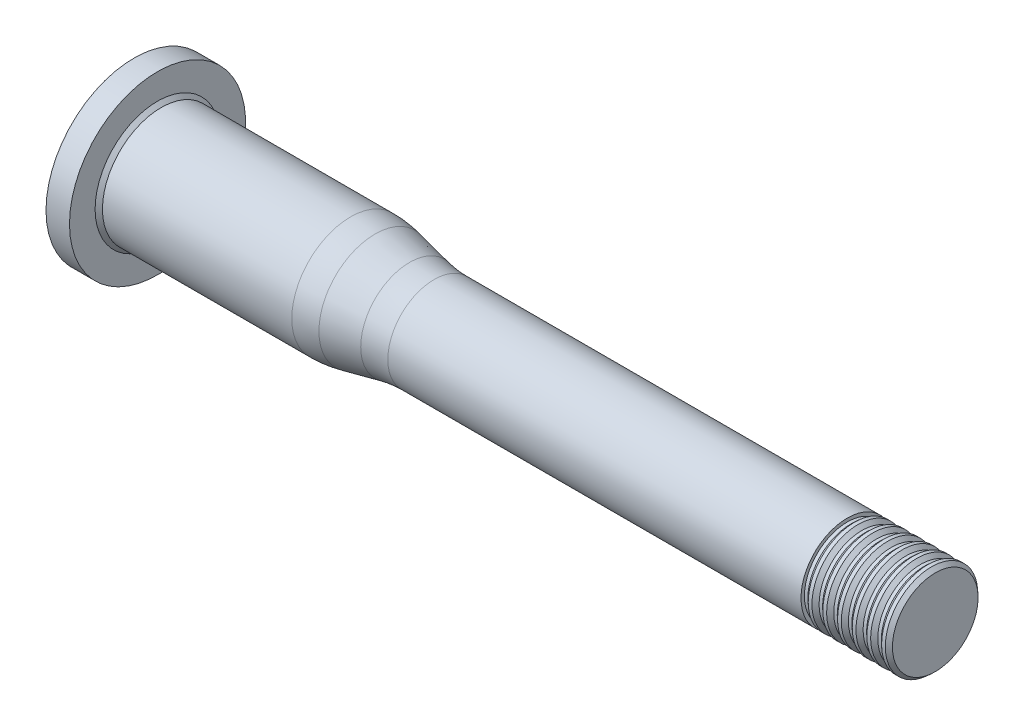
ISO-10303-21;
HEADER;
FILE_DESCRIPTION(('STEP AP214'),'2;1');
FILE_NAME('part.step','',(''),(''),'','','');
FILE_SCHEMA(('AUTOMOTIVE_DESIGN { 1 0 10303 214 1 1 1 1 }'));
ENDSEC;
DATA;
#1=APPLICATION_CONTEXT('core data for automotive mechanical design processes');
#2=APPLICATION_PROTOCOL_DEFINITION('international standard','automotive_design',2000,#1);
#3=PRODUCT_CONTEXT('',#1,'mechanical');
#4=PRODUCT('Part','Part','',(#3));
#5=PRODUCT_RELATED_PRODUCT_CATEGORY('part','',(#4));
#6=PRODUCT_DEFINITION_FORMATION('','',#4);
#7=PRODUCT_DEFINITION_CONTEXT('part definition',#1,'design');
#8=PRODUCT_DEFINITION('design','',#6,#7);
#9=PRODUCT_DEFINITION_SHAPE('','',#8);
#10=(LENGTH_UNIT() NAMED_UNIT(*) SI_UNIT(.MILLI.,.METRE.));
#11=(NAMED_UNIT(*) PLANE_ANGLE_UNIT() SI_UNIT($,.RADIAN.));
#12=(NAMED_UNIT(*) SI_UNIT($,.STERADIAN.) SOLID_ANGLE_UNIT());
#13=UNCERTAINTY_MEASURE_WITH_UNIT(LENGTH_MEASURE(1.E-05),#10,'distance_accuracy_value','');
#14=(GEOMETRIC_REPRESENTATION_CONTEXT(3) GLOBAL_UNCERTAINTY_ASSIGNED_CONTEXT((#13)) GLOBAL_UNIT_ASSIGNED_CONTEXT((#10,
#11,#12)) REPRESENTATION_CONTEXT('',''));
#15=CARTESIAN_POINT('',(0.,0.,0.));
#16=DIRECTION('',(0.,0.,1.));
#17=DIRECTION('',(1.,0.,0.));
#18=AXIS2_PLACEMENT_3D('',#15,#16,#17);
#19=CARTESIAN_POINT('',(162.676397848872,0.,0.));
#20=DIRECTION('',(1.,0.,0.));
#21=DIRECTION('',(0.,0.,-1.));
#22=AXIS2_PLACEMENT_3D('',#19,#20,#21);
#23=CONICAL_SURFACE('',#22,9.2634,0.739062507559056);
#24=CARTESIAN_POINT('',(162.676397848872,0.,0.));
#25=DIRECTION('',(-1.,0.,0.));
#26=DIRECTION('',(0.,0.,1.));
#27=AXIS2_PLACEMENT_3D('',#24,#25,#26);
#28=CIRCLE('',#27,9.2634);
#29=CARTESIAN_POINT('',(162.676397848872,0.,9.2634));
#30=VERTEX_POINT('',#29);
#31=EDGE_CURVE('E177',#30,#30,#28,.T.);
#32=ORIENTED_EDGE('',*,*,#31,.F.);
#33=EDGE_LOOP('',(#32));
#34=FACE_BOUND('',#33,.T.);
#35=CARTESIAN_POINT('',(163.484629928296,0.,0.));
#36=DIRECTION('',(1.,0.,0.));
#37=DIRECTION('',(0.,0.,-1.));
#38=AXIS2_PLACEMENT_3D('',#35,#36,#37);
#39=CIRCLE('',#38,10.);
#40=CARTESIAN_POINT('',(163.484629928296,0.,-10.));
#41=VERTEX_POINT('',#40);
#42=EDGE_CURVE('E186',#41,#41,#39,.F.);
#43=ORIENTED_EDGE('',*,*,#42,.T.);
#44=EDGE_LOOP('',(#43));
#45=FACE_BOUND('',#44,.T.);
#46=ADVANCED_FACE('F33',(#34,#45),#23,.T.);
#47=CARTESIAN_POINT('',(-11.7608101461,0.,0.));
#48=DIRECTION('',(-1.,0.,0.));
#49=DIRECTION('',(0.,0.,1.));
#50=AXIS2_PLACEMENT_3D('',#47,#48,#49);
#51=CYLINDRICAL_SURFACE('',#50,9.2634);
#52=ORIENTED_EDGE('',*,*,#31,.T.);
#53=EDGE_LOOP('',(#52));
#54=FACE_BOUND('',#53,.T.);
#55=CARTESIAN_POINT('',(161.925,0.,0.));
#56=DIRECTION('',(-1.,0.,0.));
#57=DIRECTION('',(0.,0.,1.));
#58=AXIS2_PLACEMENT_3D('',#55,#56,#57);
#59=CIRCLE('',#58,9.2634);
#60=CARTESIAN_POINT('',(161.925,0.,9.2634));
#61=VERTEX_POINT('',#60);
#62=EDGE_CURVE('E169',#61,#61,#59,.T.);
#63=ORIENTED_EDGE('',*,*,#62,.F.);
#64=EDGE_LOOP('',(#63));
#65=FACE_BOUND('',#64,.T.);
#66=ADVANCED_FACE('F251',(#54,#65),#51,.T.);
#67=CARTESIAN_POINT('',(-8.58581014610001,0.,0.));
#68=DIRECTION('',(-1.,0.,0.));
#69=DIRECTION('',(0.,0.,1.));
#70=AXIS2_PLACEMENT_3D('',#67,#68,#69);
#71=CYLINDRICAL_SURFACE('',#70,10.);
#72=ORIENTED_EDGE('',*,*,#42,.F.);
#73=EDGE_LOOP('',(#72));
#74=FACE_BOUND('',#73,.T.);
#75=CARTESIAN_POINT('',(164.291767920576,0.,0.));
#76=DIRECTION('',(-1.,0.,0.));
#77=DIRECTION('',(0.,0.,1.));
#78=AXIS2_PLACEMENT_3D('',#75,#76,#77);
#79=CIRCLE('',#78,10.);
#80=CARTESIAN_POINT('',(164.291767920576,0.,10.));
#81=VERTEX_POINT('',#80);
#82=EDGE_CURVE('E183',#81,#81,#79,.F.);
#83=ORIENTED_EDGE('',*,*,#82,.F.);
#84=EDGE_LOOP('',(#83));
#85=FACE_BOUND('',#84,.T.);
#86=ADVANCED_FACE('F257',(#74,#85),#71,.T.);
#87=CARTESIAN_POINT('',(164.263897848872,0.,0.));
#88=DIRECTION('',(-1.,0.,0.));
#89=DIRECTION('',(0.,0.,1.));
#90=AXIS2_PLACEMENT_3D('',#87,#88,#89);
#91=CONICAL_SURFACE('',#90,10.0254,0.739062507559089);
#92=CARTESIAN_POINT('',(165.1,0.,0.));
#93=DIRECTION('',(-1.,0.,0.));
#94=DIRECTION('',(0.,0.,1.));
#95=AXIS2_PLACEMENT_3D('',#92,#93,#94);
#96=CIRCLE('',#95,9.2634);
#97=CARTESIAN_POINT('',(165.1,0.,9.2634));
#98=VERTEX_POINT('',#97);
#99=EDGE_CURVE('E180',#98,#98,#96,.T.);
#100=ORIENTED_EDGE('',*,*,#99,.T.);
#101=EDGE_LOOP('',(#100));
#102=FACE_BOUND('',#101,.T.);
#103=ORIENTED_EDGE('',*,*,#82,.T.);
#104=EDGE_LOOP('',(#103));
#105=FACE_BOUND('',#104,.T.);
#106=ADVANCED_FACE('F264',(#102,#105),#91,.T.);
#107=CARTESIAN_POINT('',(168.275,0.,0.));
#108=DIRECTION('',(-1.,0.,0.));
#109=DIRECTION('',(0.,0.,1.));
#110=AXIS2_PLACEMENT_3D('',#107,#108,#109);
#111=PLANE('',#110);
#112=CARTESIAN_POINT('',(168.275,0.,0.));
#113=DIRECTION('',(-1.,0.,0.));
#114=DIRECTION('',(0.,0.,1.));
#115=AXIS2_PLACEMENT_3D('',#112,#113,#114);
#116=CIRCLE('',#115,9.2634);
#117=CARTESIAN_POINT('',(168.275,0.,9.2634));
#118=VERTEX_POINT('',#117);
#119=EDGE_CURVE('E190',#118,#118,#116,.T.);
#120=ORIENTED_EDGE('',*,*,#119,.F.);
#121=EDGE_LOOP('',(#120));
#122=FACE_BOUND('',#121,.T.);
#123=ADVANCED_FACE('F267',(#122),#111,.F.);
#124=CARTESIAN_POINT('',(167.438897848872,0.,0.));
#125=DIRECTION('',(-1.,0.,0.));
#126=DIRECTION('',(0.,0.,1.));
#127=AXIS2_PLACEMENT_3D('',#124,#125,#126);
#128=CONICAL_SURFACE('',#127,10.0254,0.739062507559089);
#129=ORIENTED_EDGE('',*,*,#119,.T.);
#130=EDGE_LOOP('',(#129));
#131=FACE_BOUND('',#130,.T.);
#132=CARTESIAN_POINT('',(167.466767920576,0.,0.));
#133=DIRECTION('',(-1.,0.,0.));
#134=DIRECTION('',(0.,0.,1.));
#135=AXIS2_PLACEMENT_3D('',#132,#133,#134);
#136=CIRCLE('',#135,10.);
#137=CARTESIAN_POINT('',(167.466767920576,0.,10.));
#138=VERTEX_POINT('',#137);
#139=EDGE_CURVE('E193',#138,#138,#136,.F.);
#140=ORIENTED_EDGE('',*,*,#139,.T.);
#141=EDGE_LOOP('',(#140));
#142=FACE_BOUND('',#141,.T.);
#143=ADVANCED_FACE('F279',(#131,#142),#128,.T.);
#144=CARTESIAN_POINT('',(166.659629928296,0.,0.));
#145=DIRECTION('',(1.,0.,0.));
#146=DIRECTION('',(0.,0.,-1.));
#147=AXIS2_PLACEMENT_3D('',#144,#145,#146);
#148=CIRCLE('',#147,10.);
#149=CARTESIAN_POINT('',(166.659629928296,0.,-10.));
#150=VERTEX_POINT('',#149);
#151=EDGE_CURVE('E196',#150,#150,#148,.F.);
#152=ORIENTED_EDGE('',*,*,#151,.F.);
#153=EDGE_LOOP('',(#152));
#154=FACE_BOUND('',#153,.T.);
#155=ORIENTED_EDGE('',*,*,#139,.F.);
#156=EDGE_LOOP('',(#155));
#157=FACE_BOUND('',#156,.T.);
#158=ADVANCED_FACE('F277',(#154,#157),#71,.T.);
#159=CARTESIAN_POINT('',(165.851397848872,0.,0.));
#160=DIRECTION('',(1.,0.,0.));
#161=DIRECTION('',(0.,0.,-1.));
#162=AXIS2_PLACEMENT_3D('',#159,#160,#161);
#163=CONICAL_SURFACE('',#162,9.2634,0.739062507559056);
#164=CARTESIAN_POINT('',(165.851397848872,0.,0.));
#165=DIRECTION('',(-1.,0.,0.));
#166=DIRECTION('',(0.,0.,1.));
#167=AXIS2_PLACEMENT_3D('',#164,#165,#166);
#168=CIRCLE('',#167,9.2634);
#169=CARTESIAN_POINT('',(165.851397848872,0.,9.2634));
#170=VERTEX_POINT('',#169);
#171=EDGE_CURVE('E187',#170,#170,#168,.T.);
#172=ORIENTED_EDGE('',*,*,#171,.F.);
#173=EDGE_LOOP('',(#172));
#174=FACE_BOUND('',#173,.T.);
#175=ORIENTED_EDGE('',*,*,#151,.T.);
#176=EDGE_LOOP('',(#175));
#177=FACE_BOUND('',#176,.T.);
#178=ADVANCED_FACE('F273',(#174,#177),#163,.T.);
#179=CARTESIAN_POINT('',(-8.58581014610001,0.,0.));
#180=DIRECTION('',(-1.,0.,0.));
#181=DIRECTION('',(0.,0.,1.));
#182=AXIS2_PLACEMENT_3D('',#179,#180,#181);
#183=CYLINDRICAL_SURFACE('',#182,9.2634);
#184=ORIENTED_EDGE('',*,*,#171,.T.);
#185=EDGE_LOOP('',(#184));
#186=FACE_BOUND('',#185,.T.);
#187=ORIENTED_EDGE('',*,*,#99,.F.);
#188=EDGE_LOOP('',(#187));
#189=FACE_BOUND('',#188,.T.);
#190=ADVANCED_FACE('F269',(#186,#189),#183,.T.);
#191=CARTESIAN_POINT('',(161.088897848872,0.,0.));
#192=DIRECTION('',(-1.,0.,0.));
#193=DIRECTION('',(0.,0.,1.));
#194=AXIS2_PLACEMENT_3D('',#191,#192,#193);
#195=CONICAL_SURFACE('',#194,10.0254,0.739062507559089);
#196=ORIENTED_EDGE('',*,*,#62,.T.);
#197=EDGE_LOOP('',(#196));
#198=FACE_BOUND('',#197,.T.);
#199=CARTESIAN_POINT('',(161.116767920576,0.,0.));
#200=DIRECTION('',(-1.,0.,0.));
#201=DIRECTION('',(0.,0.,1.));
#202=AXIS2_PLACEMENT_3D('',#199,#200,#201);
#203=CIRCLE('',#202,10.);
#204=CARTESIAN_POINT('',(161.116767920576,0.,10.));
#205=VERTEX_POINT('',#204);
#206=EDGE_CURVE('E173',#205,#205,#203,.F.);
#207=ORIENTED_EDGE('',*,*,#206,.T.);
#208=EDGE_LOOP('',(#207));
#209=FACE_BOUND('',#208,.T.);
#210=ADVANCED_FACE('F272',(#198,#209),#195,.T.);
#211=CARTESIAN_POINT('',(160.309629928296,0.,0.));
#212=DIRECTION('',(1.,0.,0.));
#213=DIRECTION('',(0.,0.,-1.));
#214=AXIS2_PLACEMENT_3D('',#211,#212,#213);
#215=CIRCLE('',#214,10.);
#216=CARTESIAN_POINT('',(160.309629928296,0.,-10.));
#217=VERTEX_POINT('',#216);
#218=EDGE_CURVE('E176',#217,#217,#215,.F.);
#219=ORIENTED_EDGE('',*,*,#218,.F.);
#220=EDGE_LOOP('',(#219));
#221=FACE_BOUND('',#220,.T.);
#222=ORIENTED_EDGE('',*,*,#206,.F.);
#223=EDGE_LOOP('',(#222));
#224=FACE_BOUND('',#223,.T.);
#225=ADVANCED_FACE('F383',(#221,#224),#71,.T.);
#226=CARTESIAN_POINT('',(159.501397848872,0.,0.));
#227=DIRECTION('',(1.,0.,0.));
#228=DIRECTION('',(0.,0.,-1.));
#229=AXIS2_PLACEMENT_3D('',#226,#227,#228);
#230=CONICAL_SURFACE('',#229,9.2634,0.739062507559056);
#231=CARTESIAN_POINT('',(159.501397848872,0.,0.));
#232=DIRECTION('',(-1.,0.,0.));
#233=DIRECTION('',(0.,0.,1.));
#234=AXIS2_PLACEMENT_3D('',#231,#232,#233);
#235=CIRCLE('',#234,9.2634);
#236=CARTESIAN_POINT('',(159.501397848872,0.,9.2634));
#237=VERTEX_POINT('',#236);
#238=EDGE_CURVE('E166',#237,#237,#235,.T.);
#239=ORIENTED_EDGE('',*,*,#238,.F.);
#240=EDGE_LOOP('',(#239));
#241=FACE_BOUND('',#240,.T.);
#242=ORIENTED_EDGE('',*,*,#218,.T.);
#243=EDGE_LOOP('',(#242));
#244=FACE_BOUND('',#243,.T.);
#245=ADVANCED_FACE('F380',(#241,#244),#230,.T.);
#246=CARTESIAN_POINT('',(-14.9358101461,0.,0.));
#247=DIRECTION('',(-1.,0.,0.));
#248=DIRECTION('',(0.,0.,1.));
#249=AXIS2_PLACEMENT_3D('',#246,#247,#248);
#250=CYLINDRICAL_SURFACE('',#249,9.2634);
#251=ORIENTED_EDGE('',*,*,#238,.T.);
#252=EDGE_LOOP('',(#251));
#253=FACE_BOUND('',#252,.T.);
#254=CARTESIAN_POINT('',(158.75,0.,0.));
#255=DIRECTION('',(-1.,0.,0.));
#256=DIRECTION('',(0.,0.,1.));
#257=AXIS2_PLACEMENT_3D('',#254,#255,#256);
#258=CIRCLE('',#257,9.2634);
#259=CARTESIAN_POINT('',(158.75,0.,9.2634));
#260=VERTEX_POINT('',#259);
#261=EDGE_CURVE('E161',#260,#260,#258,.T.);
#262=ORIENTED_EDGE('',*,*,#261,.F.);
#263=EDGE_LOOP('',(#262));
#264=FACE_BOUND('',#263,.T.);
#265=ADVANCED_FACE('F376',(#253,#264),#250,.T.);
#266=CARTESIAN_POINT('',(157.913897848872,0.,0.));
#267=DIRECTION('',(-1.,0.,0.));
#268=DIRECTION('',(0.,0.,1.));
#269=AXIS2_PLACEMENT_3D('',#266,#267,#268);
#270=CONICAL_SURFACE('',#269,10.0254,0.739062507559089);
#271=ORIENTED_EDGE('',*,*,#261,.T.);
#272=EDGE_LOOP('',(#271));
#273=FACE_BOUND('',#272,.T.);
#274=CARTESIAN_POINT('',(157.941767920576,0.,0.));
#275=DIRECTION('',(-1.,0.,0.));
#276=DIRECTION('',(0.,0.,1.));
#277=AXIS2_PLACEMENT_3D('',#274,#275,#276);
#278=CIRCLE('',#277,10.);
#279=CARTESIAN_POINT('',(157.941767920576,0.,10.));
#280=VERTEX_POINT('',#279);
#281=EDGE_CURVE('E170',#280,#280,#278,.F.);
#282=ORIENTED_EDGE('',*,*,#281,.T.);
#283=EDGE_LOOP('',(#282));
#284=FACE_BOUND('',#283,.T.);
#285=ADVANCED_FACE('F373',(#273,#284),#270,.T.);
#286=CARTESIAN_POINT('',(157.134629928296,0.,0.));
#287=DIRECTION('',(1.,0.,0.));
#288=DIRECTION('',(0.,0.,-1.));
#289=AXIS2_PLACEMENT_3D('',#286,#287,#288);
#290=CIRCLE('',#289,10.);
#291=CARTESIAN_POINT('',(157.134629928296,0.,-10.));
#292=VERTEX_POINT('',#291);
#293=EDGE_CURVE('E165',#292,#292,#290,.F.);
#294=ORIENTED_EDGE('',*,*,#293,.F.);
#295=EDGE_LOOP('',(#294));
#296=FACE_BOUND('',#295,.T.);
#297=ORIENTED_EDGE('',*,*,#281,.F.);
#298=EDGE_LOOP('',(#297));
#299=FACE_BOUND('',#298,.T.);
#300=ADVANCED_FACE('F371',(#296,#299),#71,.T.);
#301=CARTESIAN_POINT('',(156.326397848872,0.,0.));
#302=DIRECTION('',(1.,0.,0.));
#303=DIRECTION('',(0.,0.,-1.));
#304=AXIS2_PLACEMENT_3D('',#301,#302,#303);
#305=CONICAL_SURFACE('',#304,9.2634,0.739062507559056);
#306=CARTESIAN_POINT('',(156.326397848872,0.,0.));
#307=DIRECTION('',(-1.,0.,0.));
#308=DIRECTION('',(0.,0.,1.));
#309=AXIS2_PLACEMENT_3D('',#306,#307,#308);
#310=CIRCLE('',#309,9.2634);
#311=CARTESIAN_POINT('',(156.326397848872,0.,9.2634));
#312=VERTEX_POINT('',#311);
#313=EDGE_CURVE('E158',#312,#312,#310,.T.);
#314=ORIENTED_EDGE('',*,*,#313,.F.);
#315=EDGE_LOOP('',(#314));
#316=FACE_BOUND('',#315,.T.);
#317=ORIENTED_EDGE('',*,*,#293,.T.);
#318=EDGE_LOOP('',(#317));
#319=FACE_BOUND('',#318,.T.);
#320=ADVANCED_FACE('F367',(#316,#319),#305,.T.);
#321=CARTESIAN_POINT('',(-18.1108101461,0.,0.));
#322=DIRECTION('',(-1.,0.,0.));
#323=DIRECTION('',(0.,0.,1.));
#324=AXIS2_PLACEMENT_3D('',#321,#322,#323);
#325=CYLINDRICAL_SURFACE('',#324,9.2634);
#326=ORIENTED_EDGE('',*,*,#313,.T.);
#327=EDGE_LOOP('',(#326));
#328=FACE_BOUND('',#327,.T.);
#329=CARTESIAN_POINT('',(155.575,0.,0.));
#330=DIRECTION('',(-1.,0.,0.));
#331=DIRECTION('',(0.,0.,1.));
#332=AXIS2_PLACEMENT_3D('',#329,#330,#331);
#333=CIRCLE('',#332,9.2634);
#334=CARTESIAN_POINT('',(155.575,0.,9.2634));
#335=VERTEX_POINT('',#334);
#336=EDGE_CURVE('E153',#335,#335,#333,.T.);
#337=ORIENTED_EDGE('',*,*,#336,.F.);
#338=EDGE_LOOP('',(#337));
#339=FACE_BOUND('',#338,.T.);
#340=ADVANCED_FACE('F363',(#328,#339),#325,.T.);
#341=CARTESIAN_POINT('',(154.738897848872,0.,0.));
#342=DIRECTION('',(-1.,0.,0.));
#343=DIRECTION('',(0.,0.,1.));
#344=AXIS2_PLACEMENT_3D('',#341,#342,#343);
#345=CONICAL_SURFACE('',#344,10.0254,0.739062507559089);
#346=ORIENTED_EDGE('',*,*,#336,.T.);
#347=EDGE_LOOP('',(#346));
#348=FACE_BOUND('',#347,.T.);
#349=CARTESIAN_POINT('',(154.766767920576,0.,0.));
#350=DIRECTION('',(-1.,0.,0.));
#351=DIRECTION('',(0.,0.,1.));
#352=AXIS2_PLACEMENT_3D('',#349,#350,#351);
#353=CIRCLE('',#352,10.);
#354=CARTESIAN_POINT('',(154.766767920576,0.,10.));
#355=VERTEX_POINT('',#354);
#356=EDGE_CURVE('E162',#355,#355,#353,.F.);
#357=ORIENTED_EDGE('',*,*,#356,.T.);
#358=EDGE_LOOP('',(#357));
#359=FACE_BOUND('',#358,.T.);
#360=ADVANCED_FACE('F360',(#348,#359),#345,.T.);
#361=CARTESIAN_POINT('',(153.959629928296,0.,0.));
#362=DIRECTION('',(1.,0.,0.));
#363=DIRECTION('',(0.,0.,-1.));
#364=AXIS2_PLACEMENT_3D('',#361,#362,#363);
#365=CIRCLE('',#364,10.);
#366=CARTESIAN_POINT('',(153.959629928296,0.,-10.));
#367=VERTEX_POINT('',#366);
#368=EDGE_CURVE('E157',#367,#367,#365,.F.);
#369=ORIENTED_EDGE('',*,*,#368,.F.);
#370=EDGE_LOOP('',(#369));
#371=FACE_BOUND('',#370,.T.);
#372=ORIENTED_EDGE('',*,*,#356,.F.);
#373=EDGE_LOOP('',(#372));
#374=FACE_BOUND('',#373,.T.);
#375=ADVANCED_FACE('F329',(#371,#374),#71,.T.);
#376=CARTESIAN_POINT('',(153.151397848872,0.,0.));
#377=DIRECTION('',(1.,0.,0.));
#378=DIRECTION('',(0.,0.,-1.));
#379=AXIS2_PLACEMENT_3D('',#376,#377,#378);
#380=CONICAL_SURFACE('',#379,9.2634,0.739062507559056);
#381=CARTESIAN_POINT('',(153.151397848872,0.,0.));
#382=DIRECTION('',(-1.,0.,0.));
#383=DIRECTION('',(0.,0.,1.));
#384=AXIS2_PLACEMENT_3D('',#381,#382,#383);
#385=CIRCLE('',#384,9.2634);
#386=CARTESIAN_POINT('',(153.151397848872,0.,9.2634));
#387=VERTEX_POINT('',#386);
#388=EDGE_CURVE('E150',#387,#387,#385,.T.);
#389=ORIENTED_EDGE('',*,*,#388,.F.);
#390=EDGE_LOOP('',(#389));
#391=FACE_BOUND('',#390,.T.);
#392=ORIENTED_EDGE('',*,*,#368,.T.);
#393=EDGE_LOOP('',(#392));
#394=FACE_BOUND('',#393,.T.);
#395=ADVANCED_FACE('F355',(#391,#394),#380,.T.);
#396=CARTESIAN_POINT('',(-21.2858101461,0.,0.));
#397=DIRECTION('',(-1.,0.,0.));
#398=DIRECTION('',(0.,0.,1.));
#399=AXIS2_PLACEMENT_3D('',#396,#397,#398);
#400=CYLINDRICAL_SURFACE('',#399,9.2634);
#401=ORIENTED_EDGE('',*,*,#388,.T.);
#402=EDGE_LOOP('',(#401));
#403=FACE_BOUND('',#402,.T.);
#404=CARTESIAN_POINT('',(152.4,0.,0.));
#405=DIRECTION('',(-1.,0.,0.));
#406=DIRECTION('',(0.,0.,1.));
#407=AXIS2_PLACEMENT_3D('',#404,#405,#406);
#408=CIRCLE('',#407,9.2634);
#409=CARTESIAN_POINT('',(152.4,0.,9.2634));
#410=VERTEX_POINT('',#409);
#411=EDGE_CURVE('E146',#410,#410,#408,.T.);
#412=ORIENTED_EDGE('',*,*,#411,.F.);
#413=EDGE_LOOP('',(#412));
#414=FACE_BOUND('',#413,.T.);
#415=ADVANCED_FACE('F351',(#403,#414),#400,.T.);
#416=CARTESIAN_POINT('',(151.563897848872,0.,0.));
#417=DIRECTION('',(-1.,0.,0.));
#418=DIRECTION('',(0.,0.,1.));
#419=AXIS2_PLACEMENT_3D('',#416,#417,#418);
#420=CONICAL_SURFACE('',#419,10.0254,0.739062507559089);
#421=ORIENTED_EDGE('',*,*,#411,.T.);
#422=EDGE_LOOP('',(#421));
#423=FACE_BOUND('',#422,.T.);
#424=CARTESIAN_POINT('',(151.591767920576,0.,0.));
#425=DIRECTION('',(-1.,0.,0.));
#426=DIRECTION('',(0.,0.,1.));
#427=AXIS2_PLACEMENT_3D('',#424,#425,#426);
#428=CIRCLE('',#427,10.);
#429=CARTESIAN_POINT('',(151.591767920576,0.,10.));
#430=VERTEX_POINT('',#429);
#431=EDGE_CURVE('E154',#430,#430,#428,.F.);
#432=ORIENTED_EDGE('',*,*,#431,.T.);
#433=EDGE_LOOP('',(#432));
#434=FACE_BOUND('',#433,.T.);
#435=ADVANCED_FACE('F348',(#423,#434),#420,.T.);
#436=CARTESIAN_POINT('',(150.784629928296,0.,0.));
#437=DIRECTION('',(1.,0.,0.));
#438=DIRECTION('',(0.,0.,-1.));
#439=AXIS2_PLACEMENT_3D('',#436,#437,#438);
#440=CIRCLE('',#439,10.);
#441=CARTESIAN_POINT('',(150.784629928296,0.,-10.));
#442=VERTEX_POINT('',#441);
#443=EDGE_CURVE('E220',#442,#442,#440,.F.);
#444=ORIENTED_EDGE('',*,*,#443,.F.);
#445=EDGE_LOOP('',(#444));
#446=FACE_BOUND('',#445,.T.);
#447=ORIENTED_EDGE('',*,*,#431,.F.);
#448=EDGE_LOOP('',(#447));
#449=FACE_BOUND('',#448,.T.);
#450=ADVANCED_FACE('F289',(#446,#449),#71,.T.);
#451=CARTESIAN_POINT('',(149.976397848872,0.,0.));
#452=DIRECTION('',(1.,0.,0.));
#453=DIRECTION('',(0.,0.,-1.));
#454=AXIS2_PLACEMENT_3D('',#451,#452,#453);
#455=CONICAL_SURFACE('',#454,9.2634,0.739062507559056);
#456=CARTESIAN_POINT('',(149.976397848872,0.,0.));
#457=DIRECTION('',(-1.,0.,0.));
#458=DIRECTION('',(0.,0.,1.));
#459=AXIS2_PLACEMENT_3D('',#456,#457,#458);
#460=CIRCLE('',#459,9.2634);
#461=CARTESIAN_POINT('',(149.976397848872,0.,9.2634));
#462=VERTEX_POINT('',#461);
#463=EDGE_CURVE('E143',#462,#462,#460,.T.);
#464=ORIENTED_EDGE('',*,*,#463,.F.);
#465=EDGE_LOOP('',(#464));
#466=FACE_BOUND('',#465,.T.);
#467=ORIENTED_EDGE('',*,*,#443,.T.);
#468=EDGE_LOOP('',(#467));
#469=FACE_BOUND('',#468,.T.);
#470=ADVANCED_FACE('F339',(#466,#469),#455,.T.);
#471=CARTESIAN_POINT('',(-24.4608101461,0.,0.));
#472=DIRECTION('',(-1.,0.,0.));
#473=DIRECTION('',(0.,0.,1.));
#474=AXIS2_PLACEMENT_3D('',#471,#472,#473);
#475=CYLINDRICAL_SURFACE('',#474,9.2634);
#476=ORIENTED_EDGE('',*,*,#463,.T.);
#477=EDGE_LOOP('',(#476));
#478=FACE_BOUND('',#477,.T.);
#479=CARTESIAN_POINT('',(149.225,0.,0.));
#480=DIRECTION('',(-1.,0.,0.));
#481=DIRECTION('',(0.,0.,1.));
#482=AXIS2_PLACEMENT_3D('',#479,#480,#481);
#483=CIRCLE('',#482,9.2634);
#484=CARTESIAN_POINT('',(149.225,0.,9.2634));
#485=VERTEX_POINT('',#484);
#486=EDGE_CURVE('E135',#485,#485,#483,.T.);
#487=ORIENTED_EDGE('',*,*,#486,.F.);
#488=EDGE_LOOP('',(#487));
#489=FACE_BOUND('',#488,.T.);
#490=ADVANCED_FACE('F333',(#478,#489),#475,.T.);
#491=CARTESIAN_POINT('',(149.225,9.2634,0.));
#492=DIRECTION('',(1.,0.,0.));
#493=DIRECTION('',(0.,0.,-1.));
#494=AXIS2_PLACEMENT_3D('',#491,#492,#493);
#495=PLANE('',#494);
#496=ORIENTED_EDGE('',*,*,#486,.T.);
#497=EDGE_LOOP('',(#496));
#498=FACE_BOUND('',#497,.T.);
#499=CARTESIAN_POINT('',(149.225,0.,0.));
#500=DIRECTION('',(1.,0.,0.));
#501=DIRECTION('',(0.,0.,-1.));
#502=AXIS2_PLACEMENT_3D('',#499,#500,#501);
#503=CIRCLE('',#502,10.);
#504=CARTESIAN_POINT('',(149.225,0.,-10.));
#505=VERTEX_POINT('',#504);
#506=EDGE_CURVE('E149',#505,#505,#503,.T.);
#507=ORIENTED_EDGE('',*,*,#506,.T.);
#508=EDGE_LOOP('',(#507));
#509=FACE_BOUND('',#508,.T.);
#510=ADVANCED_FACE('F308',(#498,#509),#495,.T.);
#511=CARTESIAN_POINT('',(-5.08,0.,0.));
#512=DIRECTION('',(1.,0.,0.));
#513=DIRECTION('',(0.,0.,-1.));
#514=AXIS2_PLACEMENT_3D('',#511,#512,#513);
#515=PLANE('',#514);
#516=DIRECTION('',(0.,-0.5,-0.866025403784439));
#517=VECTOR('',#516,1.);
#518=CARTESIAN_POINT('',(-5.08,10.9985226280624,0.));
#519=LINE('',#518,#517);
#520=CARTESIAN_POINT('',(-5.08,10.9985226280624,0.));
#521=VERTEX_POINT('',#520);
#522=CARTESIAN_POINT('',(-5.08,5.49926131403118,-9.525));
#523=VERTEX_POINT('',#522);
#524=EDGE_CURVE('E122',#521,#523,#519,.T.);
#525=ORIENTED_EDGE('',*,*,#524,.F.);
#526=DIRECTION('',(0.,0.5,-0.866025403784439));
#527=VECTOR('',#526,1.);
#528=CARTESIAN_POINT('',(-5.08,5.49926131403119,9.525));
#529=LINE('',#528,#527);
#530=CARTESIAN_POINT('',(-5.08,5.49926131403119,9.525));
#531=VERTEX_POINT('',#530);
#532=EDGE_CURVE('E48',#531,#521,#529,.T.);
#533=ORIENTED_EDGE('',*,*,#532,.F.);
#534=DIRECTION('',(0.,1.,0.));
#535=VECTOR('',#534,1.);
#536=CARTESIAN_POINT('',(-5.08,-5.49926131403118,9.525));
#537=LINE('',#536,#535);
#538=CARTESIAN_POINT('',(-5.08,-5.49926131403118,9.525));
#539=VERTEX_POINT('',#538);
#540=EDGE_CURVE('E131',#539,#531,#537,.T.);
#541=ORIENTED_EDGE('',*,*,#540,.F.);
#542=DIRECTION('',(0.,0.5,0.866025403784438));
#543=VECTOR('',#542,1.);
#544=CARTESIAN_POINT('',(-5.08,-10.9985226280624,0.));
#545=LINE('',#544,#543);
#546=CARTESIAN_POINT('',(-5.08,-10.9985226280624,0.));
#547=VERTEX_POINT('',#546);
#548=EDGE_CURVE('E129',#547,#539,#545,.T.);
#549=ORIENTED_EDGE('',*,*,#548,.F.);
#550=DIRECTION('',(0.,-0.499999999999999,0.866025403784439));
#551=VECTOR('',#550,1.);
#552=CARTESIAN_POINT('',(-5.08,-5.49926131403119,-9.52499999999999));
#553=LINE('',#552,#551);
#554=CARTESIAN_POINT('',(-5.08,-5.49926131403119,-9.52499999999999));
#555=VERTEX_POINT('',#554);
#556=EDGE_CURVE('E96',#555,#547,#553,.T.);
#557=ORIENTED_EDGE('',*,*,#556,.F.);
#558=DIRECTION('',(0.,-1.,0.));
#559=VECTOR('',#558,1.);
#560=CARTESIAN_POINT('',(-5.08,5.49926131403118,-9.525));
#561=LINE('',#560,#559);
#562=EDGE_CURVE('E125',#523,#555,#561,.T.);
#563=ORIENTED_EDGE('',*,*,#562,.F.);
#564=EDGE_LOOP('',(#525,#533,#541,#549,#557,#563));
#565=FACE_BOUND('',#564,.T.);
#566=CARTESIAN_POINT('',(-5.08,0.,0.));
#567=DIRECTION('',(-1.,0.,0.));
#568=DIRECTION('',(0.,0.,1.));
#569=AXIS2_PLACEMENT_3D('',#566,#567,#568);
#570=CIRCLE('',#569,19.05);
#571=CARTESIAN_POINT('',(-5.08,0.,19.05));
#572=VERTEX_POINT('',#571);
#573=EDGE_CURVE('E200',#572,#572,#570,.T.);
#574=ORIENTED_EDGE('',*,*,#573,.T.);
#575=EDGE_LOOP('',(#574));
#576=FACE_BOUND('',#575,.T.);
#577=ADVANCED_FACE('F304',(#565,#576),#515,.F.);
#578=CARTESIAN_POINT('',(-8.58581014610001,0.,0.));
#579=DIRECTION('',(-1.,0.,0.));
#580=DIRECTION('',(0.,0.,1.));
#581=AXIS2_PLACEMENT_3D('',#578,#579,#580);
#582=CYLINDRICAL_SURFACE('',#581,19.05);
#583=ORIENTED_EDGE('',*,*,#573,.F.);
#584=EDGE_LOOP('',(#583));
#585=FACE_BOUND('',#584,.T.);
#586=CARTESIAN_POINT('',(0.,0.,0.));
#587=DIRECTION('',(-1.,0.,0.));
#588=DIRECTION('',(0.,0.,1.));
#589=AXIS2_PLACEMENT_3D('',#586,#587,#588);
#590=CIRCLE('',#589,19.05);
#591=CARTESIAN_POINT('',(0.,0.,19.05));
#592=VERTEX_POINT('',#591);
#593=EDGE_CURVE('E197',#592,#592,#590,.T.);
#594=ORIENTED_EDGE('',*,*,#593,.T.);
#595=EDGE_LOOP('',(#594));
#596=FACE_BOUND('',#595,.T.);
#597=ADVANCED_FACE('F301',(#585,#596),#582,.T.);
#598=CARTESIAN_POINT('',(0.,19.05,0.));
#599=DIRECTION('',(-1.,0.,0.));
#600=DIRECTION('',(0.,0.,1.));
#601=AXIS2_PLACEMENT_3D('',#598,#599,#600);
#602=PLANE('',#601);
#603=CARTESIAN_POINT('',(0.,0.,0.));
#604=DIRECTION('',(-1.,0.,0.));
#605=DIRECTION('',(0.,0.,1.));
#606=AXIS2_PLACEMENT_3D('',#603,#604,#605);
#607=CIRCLE('',#606,13.50645);
#608=CARTESIAN_POINT('',(0.,0.,13.50645));
#609=VERTEX_POINT('',#608);
#610=EDGE_CURVE('E41',#609,#609,#607,.T.);
#611=ORIENTED_EDGE('',*,*,#610,.T.);
#612=EDGE_LOOP('',(#611));
#613=FACE_BOUND('',#612,.T.);
#614=ORIENTED_EDGE('',*,*,#593,.F.);
#615=EDGE_LOOP('',(#614));
#616=FACE_BOUND('',#615,.T.);
#617=ADVANCED_FACE('F238',(#613,#616),#602,.F.);
#618=CARTESIAN_POINT('',(-8.58581014610001,0.,0.));
#619=DIRECTION('',(-1.,0.,0.));
#620=DIRECTION('',(0.,0.,1.));
#621=AXIS2_PLACEMENT_3D('',#618,#619,#620);
#622=CYLINDRICAL_SURFACE('',#621,12.7127);
#623=CARTESIAN_POINT('',(0.79374999999998,0.,0.));
#624=DIRECTION('',(-1.,0.,0.));
#625=DIRECTION('',(0.,0.,1.));
#626=AXIS2_PLACEMENT_3D('',#623,#624,#625);
#627=CIRCLE('',#626,12.7127);
#628=CARTESIAN_POINT('',(0.79374999999998,0.,12.7127));
#629=VERTEX_POINT('',#628);
#630=EDGE_CURVE('E11',#629,#629,#627,.F.);
#631=ORIENTED_EDGE('',*,*,#630,.T.);
#632=EDGE_LOOP('',(#631));
#633=FACE_BOUND('',#632,.T.);
#634=CARTESIAN_POINT('',(41.7675549202269,0.,0.));
#635=DIRECTION('',(1.,0.,0.));
#636=DIRECTION('',(0.,0.,-1.));
#637=AXIS2_PLACEMENT_3D('',#634,#635,#636);
#638=CIRCLE('',#637,12.7127);
#639=CARTESIAN_POINT('',(41.7675549202269,0.,-12.7127));
#640=VERTEX_POINT('',#639);
#641=EDGE_CURVE('E233',#640,#640,#638,.F.);
#642=ORIENTED_EDGE('',*,*,#641,.T.);
#643=EDGE_LOOP('',(#642));
#644=FACE_BOUND('',#643,.T.);
#645=ADVANCED_FACE('F294',(#633,#644),#622,.T.);
#646=CARTESIAN_POINT('',(57.15,0.,0.));
#647=DIRECTION('',(-1.,0.,0.));
#648=DIRECTION('',(0.,0.,1.));
#649=AXIS2_PLACEMENT_3D('',#646,#647,#648);
#650=CONICAL_SURFACE('',#649,10.,0.210436125354072);
#651=CARTESIAN_POINT('',(54.5267299079769,0.,0.));
#652=DIRECTION('',(-1.,0.,0.));
#653=DIRECTION('',(0.,0.,1.));
#654=AXIS2_PLACEMENT_3D('',#651,#652,#653);
#655=CIRCLE('',#654,10.5603263605221);
#656=CARTESIAN_POINT('',(54.5267299079769,0.,10.5603263605221));
#657=VERTEX_POINT('',#656);
#658=EDGE_CURVE('E227',#657,#657,#655,.T.);
#659=ORIENTED_EDGE('',*,*,#658,.T.);
#660=EDGE_LOOP('',(#659));
#661=FACE_BOUND('',#660,.T.);
#662=CARTESIAN_POINT('',(47.0732700920231,0.,0.));
#663=DIRECTION('',(1.,0.,0.));
#664=DIRECTION('',(0.,0.,-1.));
#665=AXIS2_PLACEMENT_3D('',#662,#663,#664);
#666=CIRCLE('',#665,12.1523736394779);
#667=CARTESIAN_POINT('',(47.0732700920231,0.,-12.1523736394779));
#668=VERTEX_POINT('',#667);
#669=EDGE_CURVE('E203',#668,#668,#666,.T.);
#670=ORIENTED_EDGE('',*,*,#669,.T.);
#671=EDGE_LOOP('',(#670));
#672=FACE_BOUND('',#671,.T.);
#673=ADVANCED_FACE('F290',(#661,#672),#650,.T.);
#674=CARTESIAN_POINT('',(59.8324450797731,0.,0.));
#675=DIRECTION('',(-1.,0.,0.));
#676=DIRECTION('',(0.,0.,1.));
#677=AXIS2_PLACEMENT_3D('',#674,#675,#676);
#678=CIRCLE('',#677,10.);
#679=CARTESIAN_POINT('',(59.8324450797731,0.,10.));
#680=VERTEX_POINT('',#679);
#681=EDGE_CURVE('E230',#680,#680,#678,.F.);
#682=ORIENTED_EDGE('',*,*,#681,.T.);
#683=EDGE_LOOP('',(#682));
#684=FACE_BOUND('',#683,.T.);
#685=ORIENTED_EDGE('',*,*,#506,.F.);
#686=EDGE_LOOP('',(#685));
#687=FACE_BOUND('',#686,.T.);
#688=ADVANCED_FACE('F293',(#684,#687),#71,.T.);
#689=CARTESIAN_POINT('',(1.27,5.49926131403119,9.525));
#690=DIRECTION('',(0.,0.866025403784439,0.5));
#691=DIRECTION('',(0.,-0.5,0.866025403784439));
#692=AXIS2_PLACEMENT_3D('',#689,#690,#691);
#693=PLANE('',#692);
#694=ORIENTED_EDGE('',*,*,#532,.T.);
#695=DIRECTION('',(-1.,0.,0.));
#696=VECTOR('',#695,1.);
#697=CARTESIAN_POINT('',(1.27,10.9985226280624,0.));
#698=LINE('',#697,#696);
#699=CARTESIAN_POINT('',(1.27,10.9985226280624,0.));
#700=VERTEX_POINT('',#699);
#701=EDGE_CURVE('E78',#700,#521,#698,.T.);
#702=ORIENTED_EDGE('',*,*,#701,.F.);
#703=DIRECTION('',(0.,0.5,-0.866025403784439));
#704=VECTOR('',#703,1.);
#705=CARTESIAN_POINT('',(1.27,5.49926131403119,9.525));
#706=LINE('',#705,#704);
#707=CARTESIAN_POINT('',(1.27,5.49926131403119,9.525));
#708=VERTEX_POINT('',#707);
#709=EDGE_CURVE('E133',#708,#700,#706,.T.);
#710=ORIENTED_EDGE('',*,*,#709,.F.);
#711=DIRECTION('',(-1.,0.,0.));
#712=VECTOR('',#711,1.);
#713=CARTESIAN_POINT('',(1.27,5.49926131403119,9.525));
#714=LINE('',#713,#712);
#715=EDGE_CURVE('E56',#708,#531,#714,.T.);
#716=ORIENTED_EDGE('',*,*,#715,.T.);
#717=EDGE_LOOP('',(#694,#702,#710,#716));
#718=FACE_BOUND('',#717,.T.);
#719=ADVANCED_FACE('F328',(#718),#693,.F.);
#720=CARTESIAN_POINT('',(1.27,-5.49926131403118,9.525));
#721=DIRECTION('',(0.,0.,1.));
#722=DIRECTION('',(0.,-1.,0.));
#723=AXIS2_PLACEMENT_3D('',#720,#721,#722);
#724=PLANE('',#723);
#725=ORIENTED_EDGE('',*,*,#540,.T.);
#726=ORIENTED_EDGE('',*,*,#715,.F.);
#727=DIRECTION('',(0.,1.,0.));
#728=VECTOR('',#727,1.);
#729=CARTESIAN_POINT('',(1.27,-5.49926131403118,9.525));
#730=LINE('',#729,#728);
#731=CARTESIAN_POINT('',(1.27,-5.49926131403118,9.525));
#732=VERTEX_POINT('',#731);
#733=EDGE_CURVE('E108',#732,#708,#730,.T.);
#734=ORIENTED_EDGE('',*,*,#733,.F.);
#735=DIRECTION('',(-1.,0.,0.));
#736=VECTOR('',#735,1.);
#737=CARTESIAN_POINT('',(1.27,-5.49926131403118,9.525));
#738=LINE('',#737,#736);
#739=EDGE_CURVE('E100',#732,#539,#738,.T.);
#740=ORIENTED_EDGE('',*,*,#739,.T.);
#741=EDGE_LOOP('',(#725,#726,#734,#740));
#742=FACE_BOUND('',#741,.T.);
#743=ADVANCED_FACE('F464',(#742),#724,.F.);
#744=CARTESIAN_POINT('',(1.27,-10.9985226280624,0.));
#745=DIRECTION('',(0.,-0.866025403784438,0.5));
#746=DIRECTION('',(0.,-0.5,-0.866025403784439));
#747=AXIS2_PLACEMENT_3D('',#744,#745,#746);
#748=PLANE('',#747);
#749=ORIENTED_EDGE('',*,*,#548,.T.);
#750=ORIENTED_EDGE('',*,*,#739,.F.);
#751=DIRECTION('',(0.,0.5,0.866025403784438));
#752=VECTOR('',#751,1.);
#753=CARTESIAN_POINT('',(1.27,-10.9985226280624,0.));
#754=LINE('',#753,#752);
#755=CARTESIAN_POINT('',(1.27,-10.9985226280624,0.));
#756=VERTEX_POINT('',#755);
#757=EDGE_CURVE('E104',#756,#732,#754,.T.);
#758=ORIENTED_EDGE('',*,*,#757,.F.);
#759=DIRECTION('',(-1.,0.,0.));
#760=VECTOR('',#759,1.);
#761=CARTESIAN_POINT('',(1.27,-10.9985226280624,0.));
#762=LINE('',#761,#760);
#763=EDGE_CURVE('E89',#756,#547,#762,.T.);
#764=ORIENTED_EDGE('',*,*,#763,.T.);
#765=EDGE_LOOP('',(#749,#750,#758,#764));
#766=FACE_BOUND('',#765,.T.);
#767=ADVANCED_FACE('F105',(#766),#748,.F.);
#768=CARTESIAN_POINT('',(1.27,-5.49926131403119,-9.52499999999999));
#769=DIRECTION('',(0.,-0.866025403784439,-0.499999999999999));
#770=DIRECTION('',(0.,0.499999999999999,-0.866025403784439));
#771=AXIS2_PLACEMENT_3D('',#768,#769,#770);
#772=PLANE('',#771);
#773=ORIENTED_EDGE('',*,*,#556,.T.);
#774=ORIENTED_EDGE('',*,*,#763,.F.);
#775=DIRECTION('',(0.,-0.499999999999999,0.866025403784439));
#776=VECTOR('',#775,1.);
#777=CARTESIAN_POINT('',(1.27,-5.49926131403119,-9.52499999999999));
#778=LINE('',#777,#776);
#779=CARTESIAN_POINT('',(1.27,-5.49926131403119,-9.52499999999999));
#780=VERTEX_POINT('',#779);
#781=EDGE_CURVE('E93',#780,#756,#778,.T.);
#782=ORIENTED_EDGE('',*,*,#781,.F.);
#783=DIRECTION('',(-1.,0.,0.));
#784=VECTOR('',#783,1.);
#785=CARTESIAN_POINT('',(1.27,-5.49926131403119,-9.52499999999999));
#786=LINE('',#785,#784);
#787=EDGE_CURVE('E101',#780,#555,#786,.T.);
#788=ORIENTED_EDGE('',*,*,#787,.T.);
#789=EDGE_LOOP('',(#773,#774,#782,#788));
#790=FACE_BOUND('',#789,.T.);
#791=ADVANCED_FACE('F91',(#790),#772,.F.);
#792=CARTESIAN_POINT('',(1.27,5.49926131403118,-9.525));
#793=DIRECTION('',(0.,0.,-1.));
#794=DIRECTION('',(0.,1.,0.));
#795=AXIS2_PLACEMENT_3D('',#792,#793,#794);
#796=PLANE('',#795);
#797=ORIENTED_EDGE('',*,*,#562,.T.);
#798=ORIENTED_EDGE('',*,*,#787,.F.);
#799=DIRECTION('',(0.,-1.,0.));
#800=VECTOR('',#799,1.);
#801=CARTESIAN_POINT('',(1.27,5.49926131403118,-9.525));
#802=LINE('',#801,#800);
#803=CARTESIAN_POINT('',(1.27,5.49926131403118,-9.525));
#804=VERTEX_POINT('',#803);
#805=EDGE_CURVE('E114',#804,#780,#802,.T.);
#806=ORIENTED_EDGE('',*,*,#805,.F.);
#807=DIRECTION('',(-1.,0.,0.));
#808=VECTOR('',#807,1.);
#809=CARTESIAN_POINT('',(1.27,5.49926131403118,-9.525));
#810=LINE('',#809,#808);
#811=EDGE_CURVE('E138',#804,#523,#810,.T.);
#812=ORIENTED_EDGE('',*,*,#811,.T.);
#813=EDGE_LOOP('',(#797,#798,#806,#812));
#814=FACE_BOUND('',#813,.T.);
#815=ADVANCED_FACE('F488',(#814),#796,.F.);
#816=CARTESIAN_POINT('',(1.27,10.9985226280624,0.));
#817=DIRECTION('',(0.,0.866025403784439,-0.5));
#818=DIRECTION('',(0.,0.5,0.866025403784439));
#819=AXIS2_PLACEMENT_3D('',#816,#817,#818);
#820=PLANE('',#819);
#821=ORIENTED_EDGE('',*,*,#524,.T.);
#822=ORIENTED_EDGE('',*,*,#811,.F.);
#823=DIRECTION('',(0.,-0.5,-0.866025403784439));
#824=VECTOR('',#823,1.);
#825=CARTESIAN_POINT('',(1.27,10.9985226280624,0.));
#826=LINE('',#825,#824);
#827=EDGE_CURVE('E116',#700,#804,#826,.T.);
#828=ORIENTED_EDGE('',*,*,#827,.F.);
#829=ORIENTED_EDGE('',*,*,#701,.T.);
#830=EDGE_LOOP('',(#821,#822,#828,#829));
#831=FACE_BOUND('',#830,.T.);
#832=ADVANCED_FACE('F315',(#831),#820,.F.);
#833=CARTESIAN_POINT('',(1.27,10.9985226280624,0.));
#834=DIRECTION('',(-1.,0.,0.));
#835=DIRECTION('',(0.,0.,1.));
#836=AXIS2_PLACEMENT_3D('',#833,#834,#835);
#837=PLANE('',#836);
#838=ORIENTED_EDGE('',*,*,#709,.T.);
#839=ORIENTED_EDGE('',*,*,#827,.T.);
#840=ORIENTED_EDGE('',*,*,#805,.T.);
#841=ORIENTED_EDGE('',*,*,#781,.T.);
#842=ORIENTED_EDGE('',*,*,#757,.T.);
#843=ORIENTED_EDGE('',*,*,#733,.T.);
#844=EDGE_LOOP('',(#838,#839,#840,#841,#842,#843));
#845=FACE_BOUND('',#844,.T.);
#846=ADVANCED_FACE('F111',(#845),#837,.T.);
#847=CARTESIAN_POINT('',(59.8324450797731,0.,0.));
#848=DIRECTION('',(-1.,0.,0.));
#849=DIRECTION('',(0.,0.,1.));
#850=AXIS2_PLACEMENT_3D('',#847,#848,#849);
#851=TOROIDAL_SURFACE('',#850,35.4,25.4);
#852=ORIENTED_EDGE('',*,*,#681,.F.);
#853=EDGE_LOOP('',(#852));
#854=FACE_BOUND('',#853,.T.);
#855=ORIENTED_EDGE('',*,*,#658,.F.);
#856=EDGE_LOOP('',(#855));
#857=FACE_BOUND('',#856,.T.);
#858=ADVANCED_FACE('F247',(#854,#857),#851,.F.);
#859=CARTESIAN_POINT('',(41.7675549202269,0.,0.));
#860=DIRECTION('',(1.,0.,0.));
#861=DIRECTION('',(0.,0.,-1.));
#862=AXIS2_PLACEMENT_3D('',#859,#860,#861);
#863=DEGENERATE_TOROIDAL_SURFACE('',#862,12.6873,25.4,.F.);
#864=ORIENTED_EDGE('',*,*,#669,.F.);
#865=EDGE_LOOP('',(#864));
#866=FACE_BOUND('',#865,.T.);
#867=ORIENTED_EDGE('',*,*,#641,.F.);
#868=EDGE_LOOP('',(#867));
#869=FACE_BOUND('',#868,.T.);
#870=ADVANCED_FACE('F242',(#866,#869),#863,.F.);
#871=CARTESIAN_POINT('',(0.,0.,0.));
#872=DIRECTION('',(-1.,0.,0.));
#873=DIRECTION('',(0.,0.,1.));
#874=AXIS2_PLACEMENT_3D('',#871,#872,#873);
#875=CONICAL_SURFACE('',#874,13.50645,0.785398163397446);
#876=ORIENTED_EDGE('',*,*,#630,.F.);
#877=EDGE_LOOP('',(#876));
#878=FACE_BOUND('',#877,.T.);
#879=ORIENTED_EDGE('',*,*,#610,.F.);
#880=EDGE_LOOP('',(#879));
#881=FACE_BOUND('',#880,.T.);
#882=ADVANCED_FACE('F35',(#878,#881),#875,.T.);
#883=CLOSED_SHELL('',(#46,#66,#86,#106,#123,#143,#158,#178,#190,#210,#225,#245,#265,#285,#300,
#320,#340,#360,#375,#395,#415,#435,#450,#470,#490,#510,#577,#597,#617,#645,#673,#688,#719,#743,
#767,#791,#815,#832,#846,#858,#870,#882));
#884=MANIFOLD_SOLID_BREP('B2',#883);
#885=ADVANCED_BREP_SHAPE_REPRESENTATION('',(#18,#884),#14);
#886=SHAPE_DEFINITION_REPRESENTATION(#9,#885);
ENDSEC;
END-ISO-10303-21;
